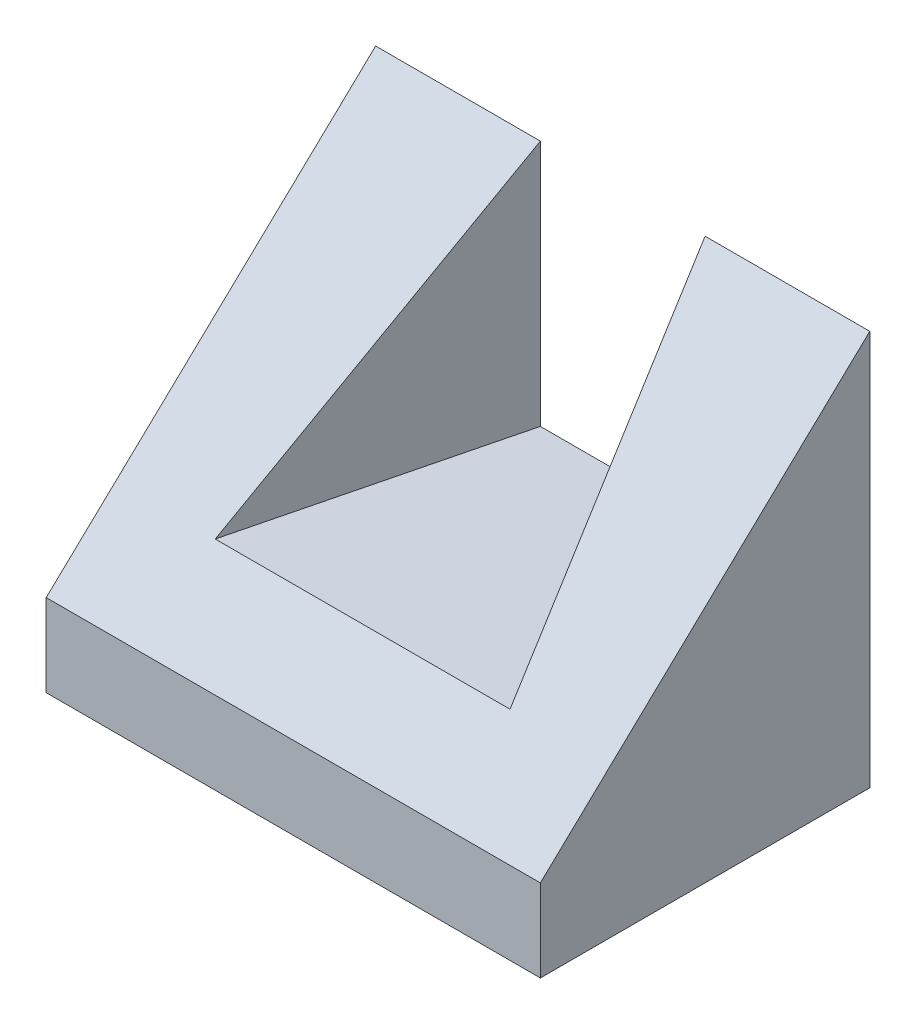
ISO-10303-21;
HEADER;
FILE_DESCRIPTION(('STEP AP214'),'2;1');
FILE_NAME('part.step','',(''),(''),'','','');
FILE_SCHEMA(('AUTOMOTIVE_DESIGN { 1 0 10303 214 1 1 1 1 }'));
ENDSEC;
DATA;
#1=APPLICATION_CONTEXT('core data for automotive mechanical design processes');
#2=APPLICATION_PROTOCOL_DEFINITION('international standard','automotive_design',2000,#1);
#3=PRODUCT_CONTEXT('',#1,'mechanical');
#4=PRODUCT('Part','Part','',(#3));
#5=PRODUCT_RELATED_PRODUCT_CATEGORY('part','',(#4));
#6=PRODUCT_DEFINITION_FORMATION('','',#4);
#7=PRODUCT_DEFINITION_CONTEXT('part definition',#1,'design');
#8=PRODUCT_DEFINITION('design','',#6,#7);
#9=PRODUCT_DEFINITION_SHAPE('','',#8);
#10=(LENGTH_UNIT() NAMED_UNIT(*) SI_UNIT(.MILLI.,.METRE.));
#11=(NAMED_UNIT(*) PLANE_ANGLE_UNIT() SI_UNIT($,.RADIAN.));
#12=(NAMED_UNIT(*) SI_UNIT($,.STERADIAN.) SOLID_ANGLE_UNIT());
#13=UNCERTAINTY_MEASURE_WITH_UNIT(LENGTH_MEASURE(1.E-05),#10,'distance_accuracy_value','');
#14=(GEOMETRIC_REPRESENTATION_CONTEXT(3) GLOBAL_UNCERTAINTY_ASSIGNED_CONTEXT((#13)) GLOBAL_UNIT_ASSIGNED_CONTEXT((#10,
#11,#12)) REPRESENTATION_CONTEXT('',''));
#15=CARTESIAN_POINT('',(0.,0.,0.));
#16=DIRECTION('',(0.,0.,1.));
#17=DIRECTION('',(1.,0.,0.));
#18=AXIS2_PLACEMENT_3D('',#15,#16,#17);
#19=CARTESIAN_POINT('',(0.,0.,-20.));
#20=DIRECTION('',(0.,0.,1.));
#21=DIRECTION('',(1.,0.,0.));
#22=AXIS2_PLACEMENT_3D('',#19,#20,#21);
#23=PLANE('',#22);
#24=DIRECTION('',(0.,1.,0.));
#25=VECTOR('',#24,1.);
#26=CARTESIAN_POINT('',(-5.,-3.,-20.));
#27=LINE('',#26,#25);
#28=CARTESIAN_POINT('',(-5.,-3.,-20.));
#29=VERTEX_POINT('',#28);
#30=CARTESIAN_POINT('',(-5.,12.,-20.));
#31=VERTEX_POINT('',#30);
#32=EDGE_CURVE('E84',#29,#31,#27,.T.);
#33=ORIENTED_EDGE('',*,*,#32,.F.);
#34=DIRECTION('',(-1.,0.,0.));
#35=VECTOR('',#34,1.);
#36=CARTESIAN_POINT('',(0.,-3.,-20.));
#37=LINE('',#36,#35);
#38=CARTESIAN_POINT('',(5.,-3.,-20.));
#39=VERTEX_POINT('',#38);
#40=EDGE_CURVE('E110',#39,#29,#37,.T.);
#41=ORIENTED_EDGE('',*,*,#40,.F.);
#42=DIRECTION('',(0.,1.,0.));
#43=VECTOR('',#42,1.);
#44=CARTESIAN_POINT('',(5.,-3.,-20.));
#45=LINE('',#44,#43);
#46=CARTESIAN_POINT('',(5.,12.,-20.));
#47=VERTEX_POINT('',#46);
#48=EDGE_CURVE('E102',#39,#47,#45,.T.);
#49=ORIENTED_EDGE('',*,*,#48,.T.);
#50=DIRECTION('',(-1.,0.,0.));
#51=VECTOR('',#50,1.);
#52=CARTESIAN_POINT('',(-15.,12.,-20.));
#53=LINE('',#52,#51);
#54=CARTESIAN_POINT('',(15.,12.,-20.));
#55=VERTEX_POINT('',#54);
#56=EDGE_CURVE('E98',#55,#47,#53,.T.);
#57=ORIENTED_EDGE('',*,*,#56,.F.);
#58=DIRECTION('',(0.,1.,0.));
#59=VECTOR('',#58,1.);
#60=CARTESIAN_POINT('',(15.,12.,-20.));
#61=LINE('',#60,#59);
#62=CARTESIAN_POINT('',(15.,-12.,-20.));
#63=VERTEX_POINT('',#62);
#64=EDGE_CURVE('E89',#63,#55,#61,.T.);
#65=ORIENTED_EDGE('',*,*,#64,.F.);
#66=DIRECTION('',(1.,0.,0.));
#67=VECTOR('',#66,1.);
#68=CARTESIAN_POINT('',(-15.,-12.,-20.));
#69=LINE('',#68,#67);
#70=CARTESIAN_POINT('',(-15.,-12.,-20.));
#71=VERTEX_POINT('',#70);
#72=EDGE_CURVE('E72',#71,#63,#69,.T.);
#73=ORIENTED_EDGE('',*,*,#72,.F.);
#74=DIRECTION('',(0.,-1.,0.));
#75=VECTOR('',#74,1.);
#76=CARTESIAN_POINT('',(-15.,12.,-20.));
#77=LINE('',#76,#75);
#78=CARTESIAN_POINT('',(-15.,12.,-20.));
#79=VERTEX_POINT('',#78);
#80=EDGE_CURVE('E96',#79,#71,#77,.T.);
#81=ORIENTED_EDGE('',*,*,#80,.F.);
#82=EDGE_CURVE('E91',#31,#79,#53,.T.);
#83=ORIENTED_EDGE('',*,*,#82,.F.);
#84=EDGE_LOOP('',(#33,#41,#49,#57,#65,#73,#81,#83));
#85=FACE_BOUND('',#84,.T.);
#86=ADVANCED_FACE('F33',(#85),#23,.F.);
#87=CARTESIAN_POINT('',(0.,0.,0.));
#88=DIRECTION('',(0.,0.,1.));
#89=DIRECTION('',(1.,0.,0.));
#90=AXIS2_PLACEMENT_3D('',#87,#88,#89);
#91=PLANE('',#90);
#92=DIRECTION('',(1.,0.,0.));
#93=VECTOR('',#92,1.);
#94=CARTESIAN_POINT('',(-15.,-7.,0.));
#95=LINE('',#94,#93);
#96=CARTESIAN_POINT('',(-15.,-7.,0.));
#97=VERTEX_POINT('',#96);
#98=CARTESIAN_POINT('',(15.,-7.,0.));
#99=VERTEX_POINT('',#98);
#100=EDGE_CURVE('E120',#97,#99,#95,.T.);
#101=ORIENTED_EDGE('',*,*,#100,.F.);
#102=DIRECTION('',(0.,-1.,0.));
#103=VECTOR('',#102,1.);
#104=CARTESIAN_POINT('',(-15.,12.,0.));
#105=LINE('',#104,#103);
#106=CARTESIAN_POINT('',(-15.,-12.,0.));
#107=VERTEX_POINT('',#106);
#108=EDGE_CURVE('E83',#97,#107,#105,.T.);
#109=ORIENTED_EDGE('',*,*,#108,.T.);
#110=DIRECTION('',(1.,0.,0.));
#111=VECTOR('',#110,1.);
#112=CARTESIAN_POINT('',(-15.,-12.,0.));
#113=LINE('',#112,#111);
#114=CARTESIAN_POINT('',(15.,-12.,0.));
#115=VERTEX_POINT('',#114);
#116=EDGE_CURVE('E70',#107,#115,#113,.T.);
#117=ORIENTED_EDGE('',*,*,#116,.T.);
#118=DIRECTION('',(0.,1.,0.));
#119=VECTOR('',#118,1.);
#120=CARTESIAN_POINT('',(15.,12.,0.));
#121=LINE('',#120,#119);
#122=EDGE_CURVE('E77',#115,#99,#121,.T.);
#123=ORIENTED_EDGE('',*,*,#122,.T.);
#124=EDGE_LOOP('',(#101,#109,#117,#123));
#125=FACE_BOUND('',#124,.T.);
#126=ADVANCED_FACE('F86',(#125),#91,.T.);
#127=CARTESIAN_POINT('',(15.,12.,-20.));
#128=DIRECTION('',(1.,0.,0.));
#129=DIRECTION('',(0.,1.,0.));
#130=AXIS2_PLACEMENT_3D('',#127,#128,#129);
#131=PLANE('',#130);
#132=DIRECTION('',(0.,0.688749461914693,-0.724999433594414));
#133=VECTOR('',#132,1.);
#134=CARTESIAN_POINT('',(15.,-7.,0.));
#135=LINE('',#134,#133);
#136=EDGE_CURVE('E80',#99,#55,#135,.T.);
#137=ORIENTED_EDGE('',*,*,#136,.F.);
#138=ORIENTED_EDGE('',*,*,#122,.F.);
#139=DIRECTION('',(0.,0.,1.));
#140=VECTOR('',#139,1.);
#141=CARTESIAN_POINT('',(15.,-12.,-20.));
#142=LINE('',#141,#140);
#143=EDGE_CURVE('E41',#63,#115,#142,.T.);
#144=ORIENTED_EDGE('',*,*,#143,.F.);
#145=ORIENTED_EDGE('',*,*,#64,.T.);
#146=EDGE_LOOP('',(#137,#138,#144,#145));
#147=FACE_BOUND('',#146,.T.);
#148=ADVANCED_FACE('F35',(#147),#131,.T.);
#149=CARTESIAN_POINT('',(-15.,-12.,-20.));
#150=DIRECTION('',(0.,-1.,0.));
#151=DIRECTION('',(0.,0.,-1.));
#152=AXIS2_PLACEMENT_3D('',#149,#150,#151);
#153=PLANE('',#152);
#154=ORIENTED_EDGE('',*,*,#116,.F.);
#155=DIRECTION('',(0.,0.,1.));
#156=VECTOR('',#155,1.);
#157=CARTESIAN_POINT('',(-15.,-12.,-20.));
#158=LINE('',#157,#156);
#159=EDGE_CURVE('E73',#71,#107,#158,.T.);
#160=ORIENTED_EDGE('',*,*,#159,.F.);
#161=ORIENTED_EDGE('',*,*,#72,.T.);
#162=ORIENTED_EDGE('',*,*,#143,.T.);
#163=EDGE_LOOP('',(#154,#160,#161,#162));
#164=FACE_BOUND('',#163,.T.);
#165=ADVANCED_FACE('F68',(#164),#153,.T.);
#166=CARTESIAN_POINT('',(-15.,12.,-20.));
#167=DIRECTION('',(-1.,0.,0.));
#168=DIRECTION('',(0.,-1.,0.));
#169=AXIS2_PLACEMENT_3D('',#166,#167,#168);
#170=PLANE('',#169);
#171=DIRECTION('',(0.,0.688749461914693,-0.724999433594414));
#172=VECTOR('',#171,1.);
#173=CARTESIAN_POINT('',(-15.,-7.,0.));
#174=LINE('',#173,#172);
#175=EDGE_CURVE('E123',#97,#79,#174,.T.);
#176=ORIENTED_EDGE('',*,*,#175,.T.);
#177=ORIENTED_EDGE('',*,*,#80,.T.);
#178=ORIENTED_EDGE('',*,*,#159,.T.);
#179=ORIENTED_EDGE('',*,*,#108,.F.);
#180=EDGE_LOOP('',(#176,#177,#178,#179));
#181=FACE_BOUND('',#180,.T.);
#182=ADVANCED_FACE('F129',(#181),#170,.T.);
#183=CARTESIAN_POINT('',(-9.41176470588235,-3.,-2.35294117647059));
#184=DIRECTION('',(0.970142500145332,0.,0.242535625036333));
#185=DIRECTION('',(0.242535625036333,0.,-0.970142500145332));
#186=AXIS2_PLACEMENT_3D('',#183,#184,#185);
#187=PLANE('',#186);
#188=DIRECTION('',(0.178344093751605,0.6777075562561,-0.713376375006422));
#189=VECTOR('',#188,1.);
#190=CARTESIAN_POINT('',(-9.19847328244275,-3.95419847328244,-3.20610687022901));
#191=LINE('',#190,#189);
#192=CARTESIAN_POINT('',(-8.94736842105263,-3.,-4.21052631578948));
#193=VERTEX_POINT('',#192);
#194=EDGE_CURVE('E116',#193,#31,#191,.T.);
#195=ORIENTED_EDGE('',*,*,#194,.F.);
#196=DIRECTION('',(0.242535625036333,0.,-0.970142500145332));
#197=VECTOR('',#196,1.);
#198=CARTESIAN_POINT('',(-9.41176470588235,-3.,-2.35294117647059));
#199=LINE('',#198,#197);
#200=EDGE_CURVE('E105',#193,#29,#199,.T.);
#201=ORIENTED_EDGE('',*,*,#200,.T.);
#202=ORIENTED_EDGE('',*,*,#32,.T.);
#203=EDGE_LOOP('',(#195,#201,#202));
#204=FACE_BOUND('',#203,.T.);
#205=ADVANCED_FACE('F153',(#204),#187,.T.);
#206=CARTESIAN_POINT('',(9.41176470588235,-3.,-2.35294117647059));
#207=DIRECTION('',(-0.970142500145332,0.,0.242535625036333));
#208=DIRECTION('',(0.242535625036333,0.,0.970142500145332));
#209=AXIS2_PLACEMENT_3D('',#206,#207,#208);
#210=PLANE('',#209);
#211=DIRECTION('',(0.178344093751605,-0.6777075562561,0.713376375006422));
#212=VECTOR('',#211,1.);
#213=CARTESIAN_POINT('',(9.19847328244275,-3.95419847328244,-3.20610687022901));
#214=LINE('',#213,#212);
#215=CARTESIAN_POINT('',(8.94736842105263,-3.,-4.21052631578948));
#216=VERTEX_POINT('',#215);
#217=EDGE_CURVE('E47',#47,#216,#214,.T.);
#218=ORIENTED_EDGE('',*,*,#217,.F.);
#219=ORIENTED_EDGE('',*,*,#48,.F.);
#220=DIRECTION('',(0.242535625036333,0.,0.970142500145332));
#221=VECTOR('',#220,1.);
#222=CARTESIAN_POINT('',(9.41176470588235,-3.,-2.35294117647059));
#223=LINE('',#222,#221);
#224=EDGE_CURVE('E113',#39,#216,#223,.T.);
#225=ORIENTED_EDGE('',*,*,#224,.T.);
#226=EDGE_LOOP('',(#218,#219,#225));
#227=FACE_BOUND('',#226,.T.);
#228=ADVANCED_FACE('F159',(#227),#210,.T.);
#229=CARTESIAN_POINT('',(0.,-3.,0.));
#230=DIRECTION('',(0.,1.,0.));
#231=DIRECTION('',(0.,0.,1.));
#232=AXIS2_PLACEMENT_3D('',#229,#230,#231);
#233=PLANE('',#232);
#234=DIRECTION('',(-1.,0.,0.));
#235=VECTOR('',#234,1.);
#236=CARTESIAN_POINT('',(0.,-3.,-4.21052631578948));
#237=LINE('',#236,#235);
#238=EDGE_CURVE('E11',#216,#193,#237,.T.);
#239=ORIENTED_EDGE('',*,*,#238,.F.);
#240=ORIENTED_EDGE('',*,*,#224,.F.);
#241=ORIENTED_EDGE('',*,*,#40,.T.);
#242=ORIENTED_EDGE('',*,*,#200,.F.);
#243=EDGE_LOOP('',(#239,#240,#241,#242));
#244=FACE_BOUND('',#243,.T.);
#245=ADVANCED_FACE('F157',(#244),#233,.T.);
#246=CARTESIAN_POINT('',(-15.,-7.,0.));
#247=DIRECTION('',(0.,-0.724999433594414,-0.688749461914693));
#248=DIRECTION('',(0.,0.688749461914693,-0.724999433594414));
#249=AXIS2_PLACEMENT_3D('',#246,#247,#248);
#250=PLANE('',#249);
#251=ORIENTED_EDGE('',*,*,#194,.T.);
#252=ORIENTED_EDGE('',*,*,#82,.T.);
#253=ORIENTED_EDGE('',*,*,#175,.F.);
#254=ORIENTED_EDGE('',*,*,#100,.T.);
#255=ORIENTED_EDGE('',*,*,#136,.T.);
#256=ORIENTED_EDGE('',*,*,#56,.T.);
#257=ORIENTED_EDGE('',*,*,#217,.T.);
#258=ORIENTED_EDGE('',*,*,#238,.T.);
#259=EDGE_LOOP('',(#251,#252,#253,#254,#255,#256,#257,#258));
#260=FACE_BOUND('',#259,.T.);
#261=ADVANCED_FACE('F166',(#260),#250,.F.);
#262=CLOSED_SHELL('',(#86,#126,#148,#165,#182,#205,#228,#245,#261));
#263=MANIFOLD_SOLID_BREP('B2',#262);
#264=ADVANCED_BREP_SHAPE_REPRESENTATION('',(#18,#263),#14);
#265=SHAPE_DEFINITION_REPRESENTATION(#9,#264);
ENDSEC;
END-ISO-10303-21;
